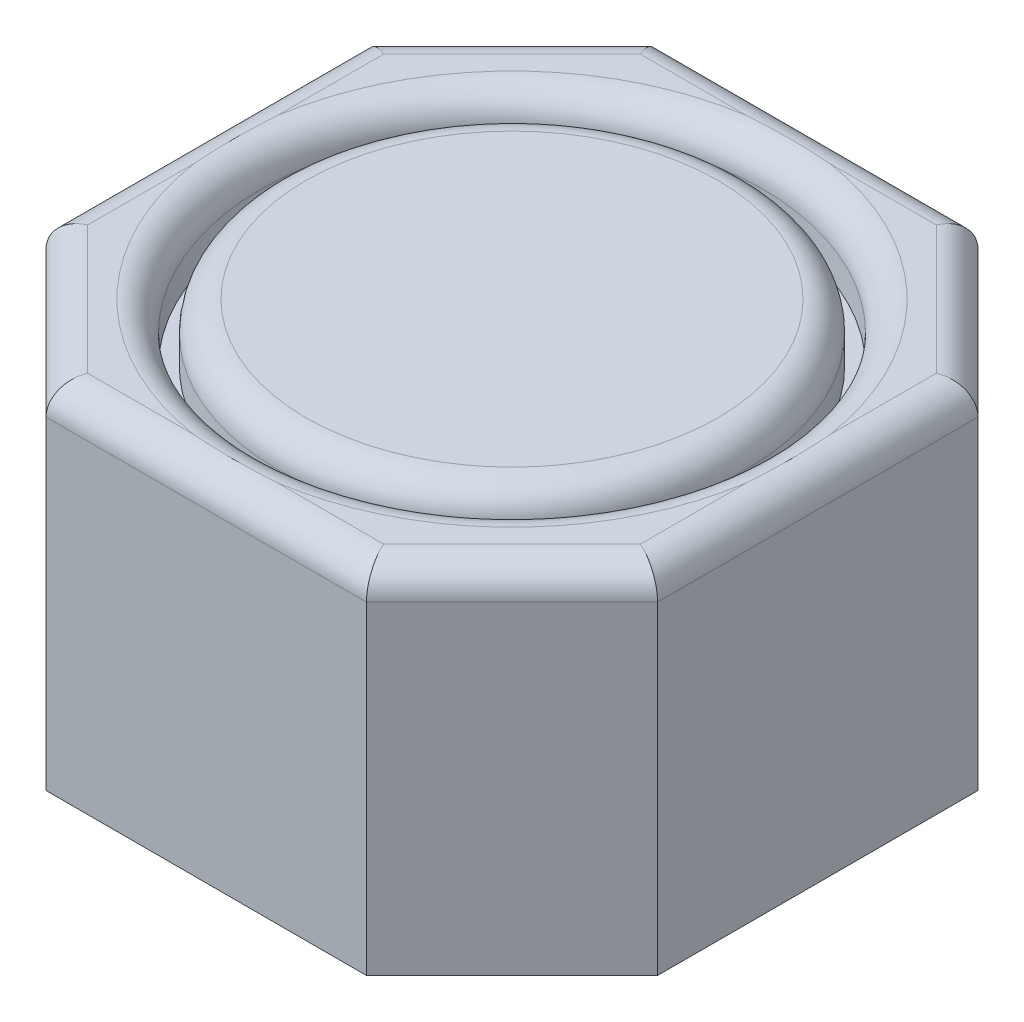
ISO-10303-21;
HEADER;
FILE_DESCRIPTION(('STEP AP214'),'2;1');
FILE_NAME('part.step','',(''),(''),'','','');
FILE_SCHEMA(('AUTOMOTIVE_DESIGN { 1 0 10303 214 1 1 1 1 }'));
ENDSEC;
DATA;
#1=APPLICATION_CONTEXT('core data for automotive mechanical design processes');
#2=APPLICATION_PROTOCOL_DEFINITION('international standard','automotive_design',2000,#1);
#3=PRODUCT_CONTEXT('',#1,'mechanical');
#4=PRODUCT('Part','Part','',(#3));
#5=PRODUCT_RELATED_PRODUCT_CATEGORY('part','',(#4));
#6=PRODUCT_DEFINITION_FORMATION('','',#4);
#7=PRODUCT_DEFINITION_CONTEXT('part definition',#1,'design');
#8=PRODUCT_DEFINITION('design','',#6,#7);
#9=PRODUCT_DEFINITION_SHAPE('','',#8);
#10=(LENGTH_UNIT() NAMED_UNIT(*) SI_UNIT(.MILLI.,.METRE.));
#11=(NAMED_UNIT(*) PLANE_ANGLE_UNIT() SI_UNIT($,.RADIAN.));
#12=(NAMED_UNIT(*) SI_UNIT($,.STERADIAN.) SOLID_ANGLE_UNIT());
#13=UNCERTAINTY_MEASURE_WITH_UNIT(LENGTH_MEASURE(1.E-05),#10,'distance_accuracy_value','');
#14=(GEOMETRIC_REPRESENTATION_CONTEXT(3) GLOBAL_UNCERTAINTY_ASSIGNED_CONTEXT((#13)) GLOBAL_UNIT_ASSIGNED_CONTEXT((#10,
#11,#12)) REPRESENTATION_CONTEXT('',''));
#15=CARTESIAN_POINT('',(0.,0.,0.));
#16=DIRECTION('',(0.,0.,1.));
#17=DIRECTION('',(1.,0.,0.));
#18=AXIS2_PLACEMENT_3D('',#15,#16,#17);
#19=CARTESIAN_POINT('',(0.,3.,0.));
#20=DIRECTION('',(0.,-1.,0.));
#21=DIRECTION('',(0.,0.,-1.));
#22=AXIS2_PLACEMENT_3D('',#19,#20,#21);
#23=PLANE('',#22);
#24=DIRECTION('',(-1.,0.,0.));
#25=VECTOR('',#24,1.);
#26=CARTESIAN_POINT('',(0.,3.,-2.35));
#27=LINE('',#26,#25);
#28=CARTESIAN_POINT('',(-0.349857460318977,3.,-2.35));
#29=VERTEX_POINT('',#28);
#30=CARTESIAN_POINT('',(-1.25900974233027,3.,-2.35));
#31=VERTEX_POINT('',#30);
#32=EDGE_CURVE('E239',#29,#31,#27,.T.);
#33=ORIENTED_EDGE('',*,*,#32,.T.);
#34=DIRECTION('',(-0.707106781186548,0.,0.707106781186548));
#35=VECTOR('',#34,1.);
#36=CARTESIAN_POINT('',(-1.80450487116513,3.,-1.80450487116513));
#37=LINE('',#36,#35);
#38=CARTESIAN_POINT('',(-2.35,3.,-1.25900974233027));
#39=VERTEX_POINT('',#38);
#40=EDGE_CURVE('E241',#31,#39,#37,.T.);
#41=ORIENTED_EDGE('',*,*,#40,.T.);
#42=DIRECTION('',(0.,0.,1.));
#43=VECTOR('',#42,1.);
#44=CARTESIAN_POINT('',(-2.35,3.,0.));
#45=LINE('',#44,#43);
#46=CARTESIAN_POINT('',(-2.35,3.,-0.349857460318965));
#47=VERTEX_POINT('',#46);
#48=EDGE_CURVE('E237',#39,#47,#45,.T.);
#49=ORIENTED_EDGE('',*,*,#48,.T.);
#50=CARTESIAN_POINT('',(0.,3.,0.));
#51=DIRECTION('',(0.,-1.,0.));
#52=DIRECTION('',(0.,0.,-1.));
#53=AXIS2_PLACEMENT_3D('',#50,#51,#52);
#54=CIRCLE('',#53,2.37589988058017);
#55=EDGE_CURVE('E235',#47,#29,#54,.T.);
#56=ORIENTED_EDGE('',*,*,#55,.T.);
#57=EDGE_LOOP('',(#33,#41,#49,#56));
#58=FACE_BOUND('',#57,.T.);
#59=ADVANCED_FACE('F37',(#58),#23,.F.);
#60=DIRECTION('',(-0.707106781186547,0.,-0.707106781186548));
#61=VECTOR('',#60,1.);
#62=CARTESIAN_POINT('',(1.80450487116513,3.,-1.80450487116513));
#63=LINE('',#62,#61);
#64=CARTESIAN_POINT('',(2.35,3.,-1.25900974233027));
#65=VERTEX_POINT('',#64);
#66=CARTESIAN_POINT('',(1.25900974233027,3.,-2.35));
#67=VERTEX_POINT('',#66);
#68=EDGE_CURVE('E230',#65,#67,#63,.T.);
#69=ORIENTED_EDGE('',*,*,#68,.T.);
#70=DIRECTION('',(-1.,0.,0.));
#71=VECTOR('',#70,1.);
#72=CARTESIAN_POINT('',(0.,3.,-2.35));
#73=LINE('',#72,#71);
#74=CARTESIAN_POINT('',(0.349857460318977,3.,-2.35));
#75=VERTEX_POINT('',#74);
#76=EDGE_CURVE('E232',#67,#75,#73,.T.);
#77=ORIENTED_EDGE('',*,*,#76,.T.);
#78=CARTESIAN_POINT('',(0.,3.,0.));
#79=DIRECTION('',(0.,-1.,0.));
#80=DIRECTION('',(0.,0.,-1.));
#81=AXIS2_PLACEMENT_3D('',#78,#79,#80);
#82=CIRCLE('',#81,2.37589988058017);
#83=CARTESIAN_POINT('',(2.35,3.,-0.349857460318983));
#84=VERTEX_POINT('',#83);
#85=EDGE_CURVE('E226',#75,#84,#82,.T.);
#86=ORIENTED_EDGE('',*,*,#85,.T.);
#87=DIRECTION('',(0.,0.,-1.));
#88=VECTOR('',#87,1.);
#89=CARTESIAN_POINT('',(2.35,3.,0.));
#90=LINE('',#89,#88);
#91=EDGE_CURVE('E228',#84,#65,#90,.T.);
#92=ORIENTED_EDGE('',*,*,#91,.T.);
#93=EDGE_LOOP('',(#69,#77,#86,#92));
#94=FACE_BOUND('',#93,.T.);
#95=ADVANCED_FACE('F349',(#94),#23,.F.);
#96=DIRECTION('',(0.707106781186547,0.,-0.707106781186548));
#97=VECTOR('',#96,1.);
#98=CARTESIAN_POINT('',(1.80450487116513,3.,1.80450487116513));
#99=LINE('',#98,#97);
#100=CARTESIAN_POINT('',(1.25900974233027,3.,2.35));
#101=VERTEX_POINT('',#100);
#102=CARTESIAN_POINT('',(2.35,3.,1.25900974233027));
#103=VERTEX_POINT('',#102);
#104=EDGE_CURVE('E221',#101,#103,#99,.T.);
#105=ORIENTED_EDGE('',*,*,#104,.T.);
#106=DIRECTION('',(0.,0.,-1.));
#107=VECTOR('',#106,1.);
#108=CARTESIAN_POINT('',(2.35,3.,0.));
#109=LINE('',#108,#107);
#110=CARTESIAN_POINT('',(2.35,3.,0.349857460318983));
#111=VERTEX_POINT('',#110);
#112=EDGE_CURVE('E223',#103,#111,#109,.T.);
#113=ORIENTED_EDGE('',*,*,#112,.T.);
#114=CARTESIAN_POINT('',(0.,3.,0.));
#115=DIRECTION('',(0.,-1.,0.));
#116=DIRECTION('',(0.,0.,-1.));
#117=AXIS2_PLACEMENT_3D('',#114,#115,#116);
#118=CIRCLE('',#117,2.37589988058017);
#119=CARTESIAN_POINT('',(0.349857460318971,3.,2.35));
#120=VERTEX_POINT('',#119);
#121=EDGE_CURVE('E217',#111,#120,#118,.T.);
#122=ORIENTED_EDGE('',*,*,#121,.T.);
#123=DIRECTION('',(1.,0.,0.));
#124=VECTOR('',#123,1.);
#125=CARTESIAN_POINT('',(0.,3.,2.35));
#126=LINE('',#125,#124);
#127=EDGE_CURVE('E219',#120,#101,#126,.T.);
#128=ORIENTED_EDGE('',*,*,#127,.T.);
#129=EDGE_LOOP('',(#105,#113,#122,#128));
#130=FACE_BOUND('',#129,.T.);
#131=ADVANCED_FACE('F346',(#130),#23,.F.);
#132=CARTESIAN_POINT('',(-2.6,3.,1.36256313292354));
#133=DIRECTION('',(1.,0.,0.));
#134=DIRECTION('',(0.,0.,-1.));
#135=AXIS2_PLACEMENT_3D('',#132,#133,#134);
#136=PLANE('',#135);
#137=DIRECTION('',(0.,-1.,0.));
#138=VECTOR('',#137,1.);
#139=CARTESIAN_POINT('',(-2.6,3.,1.36256313292354));
#140=LINE('',#139,#138);
#141=CARTESIAN_POINT('',(-2.6,2.75,1.36256313292354));
#142=VERTEX_POINT('',#141);
#143=CARTESIAN_POINT('',(-2.6,0.,1.36256313292354));
#144=VERTEX_POINT('',#143);
#145=EDGE_CURVE('E151',#142,#144,#140,.T.);
#146=ORIENTED_EDGE('',*,*,#145,.F.);
#147=DIRECTION('',(0.,0.,1.));
#148=VECTOR('',#147,1.);
#149=CARTESIAN_POINT('',(-2.6,2.75,1.36256313292354));
#150=LINE('',#149,#148);
#151=CARTESIAN_POINT('',(-2.6,2.75,-1.36256313292354));
#152=VERTEX_POINT('',#151);
#153=EDGE_CURVE('E257',#142,#152,#150,.F.);
#154=ORIENTED_EDGE('',*,*,#153,.T.);
#155=DIRECTION('',(0.,-1.,0.));
#156=VECTOR('',#155,1.);
#157=CARTESIAN_POINT('',(-2.6,3.,-1.36256313292354));
#158=LINE('',#157,#156);
#159=CARTESIAN_POINT('',(-2.6,0.,-1.36256313292354));
#160=VERTEX_POINT('',#159);
#161=EDGE_CURVE('E173',#152,#160,#158,.T.);
#162=ORIENTED_EDGE('',*,*,#161,.T.);
#163=DIRECTION('',(0.,0.,1.));
#164=VECTOR('',#163,1.);
#165=CARTESIAN_POINT('',(-2.6,0.,1.36256313292354));
#166=LINE('',#165,#164);
#167=EDGE_CURVE('E166',#160,#144,#166,.T.);
#168=ORIENTED_EDGE('',*,*,#167,.T.);
#169=EDGE_LOOP('',(#146,#154,#162,#168));
#170=FACE_BOUND('',#169,.T.);
#171=ADVANCED_FACE('F171',(#170),#136,.F.);
#172=CARTESIAN_POINT('',(-2.6,3.,1.36256313292354));
#173=DIRECTION('',(0.707106781186547,0.,-0.707106781186547));
#174=DIRECTION('',(-0.707106781186548,0.,-0.707106781186548));
#175=AXIS2_PLACEMENT_3D('',#172,#173,#174);
#176=PLANE('',#175);
#177=DIRECTION('',(0.,-1.,0.));
#178=VECTOR('',#177,1.);
#179=CARTESIAN_POINT('',(-1.36256313292354,3.,2.6));
#180=LINE('',#179,#178);
#181=CARTESIAN_POINT('',(-1.36256313292354,2.75,2.6));
#182=VERTEX_POINT('',#181);
#183=CARTESIAN_POINT('',(-1.36256313292354,0.,2.6));
#184=VERTEX_POINT('',#183);
#185=EDGE_CURVE('E160',#182,#184,#180,.T.);
#186=ORIENTED_EDGE('',*,*,#185,.F.);
#187=DIRECTION('',(0.707106781186548,0.,0.707106781186548));
#188=VECTOR('',#187,1.);
#189=CARTESIAN_POINT('',(-2.6,2.75,1.36256313292354));
#190=LINE('',#189,#188);
#191=EDGE_CURVE('E54',#182,#142,#190,.F.);
#192=ORIENTED_EDGE('',*,*,#191,.T.);
#193=ORIENTED_EDGE('',*,*,#145,.T.);
#194=DIRECTION('',(0.707106781186548,0.,0.707106781186548));
#195=VECTOR('',#194,1.);
#196=CARTESIAN_POINT('',(-2.6,0.,1.36256313292354));
#197=LINE('',#196,#195);
#198=EDGE_CURVE('E154',#144,#184,#197,.T.);
#199=ORIENTED_EDGE('',*,*,#198,.T.);
#200=EDGE_LOOP('',(#186,#192,#193,#199));
#201=FACE_BOUND('',#200,.T.);
#202=ADVANCED_FACE('F153',(#201),#176,.F.);
#203=CARTESIAN_POINT('',(-1.36256313292354,3.,2.6));
#204=DIRECTION('',(0.,0.,-1.));
#205=DIRECTION('',(-1.,0.,0.));
#206=AXIS2_PLACEMENT_3D('',#203,#204,#205);
#207=PLANE('',#206);
#208=DIRECTION('',(0.,-1.,0.));
#209=VECTOR('',#208,1.);
#210=CARTESIAN_POINT('',(1.36256313292354,3.,2.6));
#211=LINE('',#210,#209);
#212=CARTESIAN_POINT('',(1.36256313292354,2.75,2.6));
#213=VERTEX_POINT('',#212);
#214=CARTESIAN_POINT('',(1.36256313292354,0.,2.6));
#215=VERTEX_POINT('',#214);
#216=EDGE_CURVE('E206',#213,#215,#211,.T.);
#217=ORIENTED_EDGE('',*,*,#216,.F.);
#218=DIRECTION('',(1.,0.,0.));
#219=VECTOR('',#218,1.);
#220=CARTESIAN_POINT('',(-1.36256313292354,2.75,2.6));
#221=LINE('',#220,#219);
#222=EDGE_CURVE('E62',#213,#182,#221,.F.);
#223=ORIENTED_EDGE('',*,*,#222,.T.);
#224=ORIENTED_EDGE('',*,*,#185,.T.);
#225=DIRECTION('',(1.,0.,0.));
#226=VECTOR('',#225,1.);
#227=CARTESIAN_POINT('',(-1.36256313292354,0.,2.6));
#228=LINE('',#227,#226);
#229=EDGE_CURVE('E169',#184,#215,#228,.T.);
#230=ORIENTED_EDGE('',*,*,#229,.T.);
#231=EDGE_LOOP('',(#217,#223,#224,#230));
#232=FACE_BOUND('',#231,.T.);
#233=ADVANCED_FACE('F424',(#232),#207,.F.);
#234=CARTESIAN_POINT('',(1.36256313292354,3.,2.6));
#235=DIRECTION('',(-0.707106781186548,0.,-0.707106781186547));
#236=DIRECTION('',(-0.707106781186547,0.,0.707106781186548));
#237=AXIS2_PLACEMENT_3D('',#234,#235,#236);
#238=PLANE('',#237);
#239=DIRECTION('',(0.,-1.,0.));
#240=VECTOR('',#239,1.);
#241=CARTESIAN_POINT('',(2.6,3.,1.36256313292354));
#242=LINE('',#241,#240);
#243=CARTESIAN_POINT('',(2.6,2.75,1.36256313292354));
#244=VERTEX_POINT('',#243);
#245=CARTESIAN_POINT('',(2.6,0.,1.36256313292354));
#246=VERTEX_POINT('',#245);
#247=EDGE_CURVE('E204',#244,#246,#242,.T.);
#248=ORIENTED_EDGE('',*,*,#247,.F.);
#249=DIRECTION('',(0.707106781186547,0.,-0.707106781186548));
#250=VECTOR('',#249,1.);
#251=CARTESIAN_POINT('',(1.36256313292354,2.75,2.6));
#252=LINE('',#251,#250);
#253=EDGE_CURVE('E253',#244,#213,#252,.F.);
#254=ORIENTED_EDGE('',*,*,#253,.T.);
#255=ORIENTED_EDGE('',*,*,#216,.T.);
#256=DIRECTION('',(0.707106781186547,0.,-0.707106781186548));
#257=VECTOR('',#256,1.);
#258=CARTESIAN_POINT('',(1.36256313292354,0.,2.6));
#259=LINE('',#258,#257);
#260=EDGE_CURVE('E183',#215,#246,#259,.T.);
#261=ORIENTED_EDGE('',*,*,#260,.T.);
#262=EDGE_LOOP('',(#248,#254,#255,#261));
#263=FACE_BOUND('',#262,.T.);
#264=ADVANCED_FACE('F423',(#263),#238,.F.);
#265=CARTESIAN_POINT('',(2.6,3.,1.36256313292354));
#266=DIRECTION('',(-1.,0.,0.));
#267=DIRECTION('',(0.,0.,1.));
#268=AXIS2_PLACEMENT_3D('',#265,#266,#267);
#269=PLANE('',#268);
#270=DIRECTION('',(0.,-1.,0.));
#271=VECTOR('',#270,1.);
#272=CARTESIAN_POINT('',(2.6,3.,-1.36256313292354));
#273=LINE('',#272,#271);
#274=CARTESIAN_POINT('',(2.6,2.75,-1.36256313292354));
#275=VERTEX_POINT('',#274);
#276=CARTESIAN_POINT('',(2.6,0.,-1.36256313292354));
#277=VERTEX_POINT('',#276);
#278=EDGE_CURVE('E202',#275,#277,#273,.T.);
#279=ORIENTED_EDGE('',*,*,#278,.F.);
#280=DIRECTION('',(0.,0.,-1.));
#281=VECTOR('',#280,1.);
#282=CARTESIAN_POINT('',(2.6,2.75,1.36256313292354));
#283=LINE('',#282,#281);
#284=EDGE_CURVE('E251',#275,#244,#283,.F.);
#285=ORIENTED_EDGE('',*,*,#284,.T.);
#286=ORIENTED_EDGE('',*,*,#247,.T.);
#287=DIRECTION('',(0.,0.,-1.));
#288=VECTOR('',#287,1.);
#289=CARTESIAN_POINT('',(2.6,0.,1.36256313292354));
#290=LINE('',#289,#288);
#291=EDGE_CURVE('E186',#246,#277,#290,.T.);
#292=ORIENTED_EDGE('',*,*,#291,.T.);
#293=EDGE_LOOP('',(#279,#285,#286,#292));
#294=FACE_BOUND('',#293,.T.);
#295=ADVANCED_FACE('F400',(#294),#269,.F.);
#296=CARTESIAN_POINT('',(1.36256313292354,3.,-2.6));
#297=DIRECTION('',(-0.707106781186548,0.,0.707106781186547));
#298=DIRECTION('',(0.707106781186547,0.,0.707106781186548));
#299=AXIS2_PLACEMENT_3D('',#296,#297,#298);
#300=PLANE('',#299);
#301=DIRECTION('',(0.,-1.,0.));
#302=VECTOR('',#301,1.);
#303=CARTESIAN_POINT('',(1.36256313292354,3.,-2.6));
#304=LINE('',#303,#302);
#305=CARTESIAN_POINT('',(1.36256313292354,2.75,-2.6));
#306=VERTEX_POINT('',#305);
#307=CARTESIAN_POINT('',(1.36256313292354,0.,-2.6));
#308=VERTEX_POINT('',#307);
#309=EDGE_CURVE('E200',#306,#308,#304,.T.);
#310=ORIENTED_EDGE('',*,*,#309,.F.);
#311=DIRECTION('',(-0.707106781186547,0.,-0.707106781186548));
#312=VECTOR('',#311,1.);
#313=CARTESIAN_POINT('',(1.36256313292354,2.75,-2.6));
#314=LINE('',#313,#312);
#315=EDGE_CURVE('E249',#306,#275,#314,.F.);
#316=ORIENTED_EDGE('',*,*,#315,.T.);
#317=ORIENTED_EDGE('',*,*,#278,.T.);
#318=DIRECTION('',(-0.707106781186547,0.,-0.707106781186548));
#319=VECTOR('',#318,1.);
#320=CARTESIAN_POINT('',(1.36256313292354,0.,-2.6));
#321=LINE('',#320,#319);
#322=EDGE_CURVE('E189',#277,#308,#321,.T.);
#323=ORIENTED_EDGE('',*,*,#322,.T.);
#324=EDGE_LOOP('',(#310,#316,#317,#323));
#325=FACE_BOUND('',#324,.T.);
#326=ADVANCED_FACE('F397',(#325),#300,.F.);
#327=CARTESIAN_POINT('',(-1.36256313292354,3.,-2.6));
#328=DIRECTION('',(0.,0.,1.));
#329=DIRECTION('',(1.,0.,0.));
#330=AXIS2_PLACEMENT_3D('',#327,#328,#329);
#331=PLANE('',#330);
#332=DIRECTION('',(0.,-1.,0.));
#333=VECTOR('',#332,1.);
#334=CARTESIAN_POINT('',(-1.36256313292354,3.,-2.6));
#335=LINE('',#334,#333);
#336=CARTESIAN_POINT('',(-1.36256313292354,2.75,-2.6));
#337=VERTEX_POINT('',#336);
#338=CARTESIAN_POINT('',(-1.36256313292354,0.,-2.6));
#339=VERTEX_POINT('',#338);
#340=EDGE_CURVE('E198',#337,#339,#335,.T.);
#341=ORIENTED_EDGE('',*,*,#340,.F.);
#342=DIRECTION('',(-1.,0.,0.));
#343=VECTOR('',#342,1.);
#344=CARTESIAN_POINT('',(-1.36256313292354,2.75,-2.6));
#345=LINE('',#344,#343);
#346=EDGE_CURVE('E247',#337,#306,#345,.F.);
#347=ORIENTED_EDGE('',*,*,#346,.T.);
#348=ORIENTED_EDGE('',*,*,#309,.T.);
#349=DIRECTION('',(-1.,0.,0.));
#350=VECTOR('',#349,1.);
#351=CARTESIAN_POINT('',(-1.36256313292354,0.,-2.6));
#352=LINE('',#351,#350);
#353=EDGE_CURVE('E192',#308,#339,#352,.T.);
#354=ORIENTED_EDGE('',*,*,#353,.T.);
#355=EDGE_LOOP('',(#341,#347,#348,#354));
#356=FACE_BOUND('',#355,.T.);
#357=ADVANCED_FACE('F365',(#356),#331,.F.);
#358=CARTESIAN_POINT('',(-2.6,3.,-1.36256313292354));
#359=DIRECTION('',(0.707106781186547,0.,0.707106781186547));
#360=DIRECTION('',(0.707106781186548,0.,-0.707106781186548));
#361=AXIS2_PLACEMENT_3D('',#358,#359,#360);
#362=PLANE('',#361);
#363=ORIENTED_EDGE('',*,*,#161,.F.);
#364=DIRECTION('',(-0.707106781186548,0.,0.707106781186548));
#365=VECTOR('',#364,1.);
#366=CARTESIAN_POINT('',(-2.6,2.75,-1.36256313292354));
#367=LINE('',#366,#365);
#368=EDGE_CURVE('E244',#152,#337,#367,.F.);
#369=ORIENTED_EDGE('',*,*,#368,.T.);
#370=ORIENTED_EDGE('',*,*,#340,.T.);
#371=DIRECTION('',(-0.707106781186548,0.,0.707106781186548));
#372=VECTOR('',#371,1.);
#373=CARTESIAN_POINT('',(-2.6,0.,-1.36256313292354));
#374=LINE('',#373,#372);
#375=EDGE_CURVE('E195',#339,#160,#374,.T.);
#376=ORIENTED_EDGE('',*,*,#375,.T.);
#377=EDGE_LOOP('',(#363,#369,#370,#376));
#378=FACE_BOUND('',#377,.T.);
#379=ADVANCED_FACE('F358',(#378),#362,.F.);
#380=DIRECTION('',(0.707106781186548,0.,0.707106781186548));
#381=VECTOR('',#380,1.);
#382=CARTESIAN_POINT('',(-1.80450487116513,3.,1.80450487116513));
#383=LINE('',#382,#381);
#384=CARTESIAN_POINT('',(-2.35,3.,1.25900974233027));
#385=VERTEX_POINT('',#384);
#386=CARTESIAN_POINT('',(-1.25900974233027,3.,2.35));
#387=VERTEX_POINT('',#386);
#388=EDGE_CURVE('E212',#385,#387,#383,.T.);
#389=ORIENTED_EDGE('',*,*,#388,.T.);
#390=DIRECTION('',(1.,0.,0.));
#391=VECTOR('',#390,1.);
#392=CARTESIAN_POINT('',(0.,3.,2.35));
#393=LINE('',#392,#391);
#394=CARTESIAN_POINT('',(-0.349857460318971,3.,2.35));
#395=VERTEX_POINT('',#394);
#396=EDGE_CURVE('E214',#387,#395,#393,.T.);
#397=ORIENTED_EDGE('',*,*,#396,.T.);
#398=CARTESIAN_POINT('',(0.,3.,0.));
#399=DIRECTION('',(0.,-1.,0.));
#400=DIRECTION('',(0.,0.,-1.));
#401=AXIS2_PLACEMENT_3D('',#398,#399,#400);
#402=CIRCLE('',#401,2.37589988058017);
#403=CARTESIAN_POINT('',(-2.35,3.,0.349857460318965));
#404=VERTEX_POINT('',#403);
#405=EDGE_CURVE('E159',#395,#404,#402,.T.);
#406=ORIENTED_EDGE('',*,*,#405,.T.);
#407=DIRECTION('',(0.,0.,1.));
#408=VECTOR('',#407,1.);
#409=CARTESIAN_POINT('',(-2.35,3.,0.));
#410=LINE('',#409,#408);
#411=EDGE_CURVE('E210',#404,#385,#410,.T.);
#412=ORIENTED_EDGE('',*,*,#411,.T.);
#413=EDGE_LOOP('',(#389,#397,#406,#412));
#414=FACE_BOUND('',#413,.T.);
#415=ADVANCED_FACE('F345',(#414),#23,.F.);
#416=CARTESIAN_POINT('',(0.,0.,0.));
#417=DIRECTION('',(0.,-1.,0.));
#418=DIRECTION('',(0.,0.,-1.));
#419=AXIS2_PLACEMENT_3D('',#416,#417,#418);
#420=PLANE('',#419);
#421=ORIENTED_EDGE('',*,*,#167,.F.);
#422=ORIENTED_EDGE('',*,*,#375,.F.);
#423=ORIENTED_EDGE('',*,*,#353,.F.);
#424=ORIENTED_EDGE('',*,*,#322,.F.);
#425=ORIENTED_EDGE('',*,*,#291,.F.);
#426=ORIENTED_EDGE('',*,*,#260,.F.);
#427=ORIENTED_EDGE('',*,*,#229,.F.);
#428=ORIENTED_EDGE('',*,*,#198,.F.);
#429=EDGE_LOOP('',(#421,#422,#423,#424,#425,#426,#427,#428));
#430=FACE_BOUND('',#429,.T.);
#431=ADVANCED_FACE('F164',(#430),#420,.T.);
#432=CARTESIAN_POINT('',(0.,2.5,0.));
#433=DIRECTION('',(0.,1.,0.));
#434=DIRECTION('',(0.,0.,1.));
#435=AXIS2_PLACEMENT_3D('',#432,#433,#434);
#436=CYLINDRICAL_SURFACE('',#435,2.);
#437=CARTESIAN_POINT('',(0.,2.75,0.));
#438=DIRECTION('',(0.,-1.,0.));
#439=DIRECTION('',(0.,0.,-1.));
#440=AXIS2_PLACEMENT_3D('',#437,#438,#439);
#441=CIRCLE('',#440,2.);
#442=CARTESIAN_POINT('',(0.,2.75,-2.));
#443=VERTEX_POINT('',#442);
#444=EDGE_CURVE('E11',#443,#443,#441,.T.);
#445=ORIENTED_EDGE('',*,*,#444,.T.);
#446=EDGE_LOOP('',(#445));
#447=FACE_BOUND('',#446,.T.);
#448=CARTESIAN_POINT('',(0.,2.5,0.));
#449=DIRECTION('',(0.,1.,0.));
#450=DIRECTION('',(0.,0.,1.));
#451=AXIS2_PLACEMENT_3D('',#448,#449,#450);
#452=CIRCLE('',#451,2.);
#453=CARTESIAN_POINT('',(0.,2.5,2.));
#454=VERTEX_POINT('',#453);
#455=EDGE_CURVE('E178',#454,#454,#452,.T.);
#456=ORIENTED_EDGE('',*,*,#455,.T.);
#457=EDGE_LOOP('',(#456));
#458=FACE_BOUND('',#457,.T.);
#459=ADVANCED_FACE('F364',(#447,#458),#436,.T.);
#460=CARTESIAN_POINT('',(0.,2.5,0.));
#461=DIRECTION('',(0.,1.,0.));
#462=DIRECTION('',(0.,0.,1.));
#463=AXIS2_PLACEMENT_3D('',#460,#461,#462);
#464=CYLINDRICAL_SURFACE('',#463,2.12589988058017);
#465=CARTESIAN_POINT('',(0.,2.75,0.));
#466=DIRECTION('',(0.,-1.,0.));
#467=DIRECTION('',(0.,0.,-1.));
#468=AXIS2_PLACEMENT_3D('',#465,#466,#467);
#469=CIRCLE('',#468,2.12589988058017);
#470=CARTESIAN_POINT('',(0.,2.75,-2.12589988058017));
#471=VERTEX_POINT('',#470);
#472=EDGE_CURVE('E259',#471,#471,#469,.F.);
#473=ORIENTED_EDGE('',*,*,#472,.T.);
#474=EDGE_LOOP('',(#473));
#475=FACE_BOUND('',#474,.T.);
#476=CARTESIAN_POINT('',(0.,2.5,0.));
#477=DIRECTION('',(0.,1.,0.));
#478=DIRECTION('',(0.,0.,1.));
#479=AXIS2_PLACEMENT_3D('',#476,#477,#478);
#480=CIRCLE('',#479,2.12589988058017);
#481=CARTESIAN_POINT('',(0.,2.5,2.12589988058017));
#482=VERTEX_POINT('',#481);
#483=EDGE_CURVE('E175',#482,#482,#480,.T.);
#484=ORIENTED_EDGE('',*,*,#483,.F.);
#485=EDGE_LOOP('',(#484));
#486=FACE_BOUND('',#485,.T.);
#487=ADVANCED_FACE('F449',(#475,#486),#464,.F.);
#488=CARTESIAN_POINT('',(0.,2.5,0.));
#489=DIRECTION('',(0.,1.,0.));
#490=DIRECTION('',(0.,0.,1.));
#491=AXIS2_PLACEMENT_3D('',#488,#489,#490);
#492=PLANE('',#491);
#493=ORIENTED_EDGE('',*,*,#455,.F.);
#494=EDGE_LOOP('',(#493));
#495=FACE_BOUND('',#494,.T.);
#496=ORIENTED_EDGE('',*,*,#483,.T.);
#497=EDGE_LOOP('',(#496));
#498=FACE_BOUND('',#497,.T.);
#499=ADVANCED_FACE('F342',(#495,#498),#492,.T.);
#500=CARTESIAN_POINT('',(0.,3.,0.));
#501=DIRECTION('',(0.,-1.,0.));
#502=DIRECTION('',(0.,0.,-1.));
#503=AXIS2_PLACEMENT_3D('',#500,#501,#502);
#504=CIRCLE('',#503,1.75);
#505=CARTESIAN_POINT('',(0.,3.,-1.75));
#506=VERTEX_POINT('',#505);
#507=EDGE_CURVE('E46',#506,#506,#504,.F.);
#508=ORIENTED_EDGE('',*,*,#507,.T.);
#509=EDGE_LOOP('',(#508));
#510=FACE_BOUND('',#509,.T.);
#511=ADVANCED_FACE('F337',(#510),#23,.F.);
#512=CARTESIAN_POINT('',(1.80450487116513,2.75,1.80450487116513));
#513=DIRECTION('',(0.707106781186547,0.,-0.707106781186548));
#514=DIRECTION('',(-0.707106781186548,0.,-0.707106781186547));
#515=AXIS2_PLACEMENT_3D('',#512,#513,#514);
#516=CYLINDRICAL_SURFACE('',#515,0.25);
#517=CARTESIAN_POINT('',(1.25900974233027,2.75,2.35));
#518=DIRECTION('',(0.923879532511287,0.,-0.38268343236509));
#519=DIRECTION('',(0.38268343236509,0.,0.923879532511287));
#520=AXIS2_PLACEMENT_3D('',#517,#518,#519);
#521=ELLIPSE('',#520,0.270598050073099,0.25);
#522=EDGE_CURVE('E409',#213,#101,#521,.F.);
#523=ORIENTED_EDGE('',*,*,#522,.F.);
#524=ORIENTED_EDGE('',*,*,#253,.F.);
#525=CARTESIAN_POINT('',(2.35,2.75,1.25900974233027));
#526=DIRECTION('',(0.38268343236509,0.,-0.923879532511287));
#527=DIRECTION('',(0.923879532511287,0.,0.38268343236509));
#528=AXIS2_PLACEMENT_3D('',#525,#526,#527);
#529=ELLIPSE('',#528,0.270598050073099,0.25);
#530=EDGE_CURVE('E41',#103,#244,#529,.T.);
#531=ORIENTED_EDGE('',*,*,#530,.F.);
#532=ORIENTED_EDGE('',*,*,#104,.F.);
#533=EDGE_LOOP('',(#523,#524,#531,#532));
#534=FACE_BOUND('',#533,.T.);
#535=ADVANCED_FACE('F331',(#534),#516,.T.);
#536=CARTESIAN_POINT('',(2.35,2.75,0.));
#537=DIRECTION('',(0.,0.,-1.));
#538=DIRECTION('',(-1.,0.,0.));
#539=AXIS2_PLACEMENT_3D('',#536,#537,#538);
#540=CYLINDRICAL_SURFACE('',#539,0.25);
#541=ORIENTED_EDGE('',*,*,#530,.T.);
#542=ORIENTED_EDGE('',*,*,#284,.F.);
#543=CARTESIAN_POINT('',(2.35,2.75,-1.25900974233027));
#544=DIRECTION('',(-0.38268343236509,0.,-0.923879532511287));
#545=DIRECTION('',(0.923879532511287,0.,-0.38268343236509));
#546=AXIS2_PLACEMENT_3D('',#543,#544,#545);
#547=ELLIPSE('',#546,0.270598050073099,0.25);
#548=EDGE_CURVE('E325',#65,#275,#547,.T.);
#549=ORIENTED_EDGE('',*,*,#548,.F.);
#550=ORIENTED_EDGE('',*,*,#91,.F.);
#551=CARTESIAN_POINT('',(2.35,3.00000000000001,0.349857460318981));
#552=CARTESIAN_POINT('',(2.35020280118476,2.99999996778751,0.347118045146289));
#553=CARTESIAN_POINT('',(2.35040323180037,2.99999972309066,0.344378436709852));
#554=CARTESIAN_POINT('',(2.35661996064454,2.99998571786577,0.258381054958786));
#555=CARTESIAN_POINT('',(2.36044877854258,2.99978608784383,0.174949431486071));
#556=CARTESIAN_POINT('',(2.36368056561342,2.9996313486657,0.00799781763714711));
#557=CARTESIAN_POINT('',(2.3630830302689,2.9996762673831,-0.0755221817273699));
#558=CARTESIAN_POINT('',(2.35822633796701,2.99987082819775,-0.219914021400877));
#559=CARTESIAN_POINT('',(2.35499781200885,2.99998897113619,-0.280821075719154));
#560=CARTESIAN_POINT('',(2.35040323073713,2.9999997411647,-0.34437842975933));
#561=CARTESIAN_POINT('',(2.35020280007557,2.99999998658301,-0.347118038096838));
#562=CARTESIAN_POINT('',(2.35,3.00000000000001,-0.349857460318981));
#563=B_SPLINE_CURVE_WITH_KNOTS('',3,(#551,#552,#553,#554,#555,#556,#557,#558,#559,#560,#561,
#562),.UNSPECIFIED.,.F.,.F.,(4,2,2,2,2,4),(0.,0.00824078649335676,0.258663721084887,
0.509115199410257,0.692043295851107,0.700284082344464),.UNSPECIFIED.);
#564=EDGE_CURVE('E317',#111,#84,#563,.T.);
#565=ORIENTED_EDGE('',*,*,#564,.F.);
#566=ORIENTED_EDGE('',*,*,#112,.F.);
#567=EDGE_LOOP('',(#541,#542,#549,#550,#565,#566));
#568=FACE_BOUND('',#567,.T.);
#569=ADVANCED_FACE('F327',(#568),#540,.T.);
#570=CARTESIAN_POINT('',(0.,2.75,2.35));
#571=DIRECTION('',(1.,0.,0.));
#572=DIRECTION('',(0.,0.,-1.));
#573=AXIS2_PLACEMENT_3D('',#570,#571,#572);
#574=CYLINDRICAL_SURFACE('',#573,0.25);
#575=ORIENTED_EDGE('',*,*,#522,.T.);
#576=ORIENTED_EDGE('',*,*,#127,.F.);
#577=CARTESIAN_POINT('',(-0.349857460318973,3.00000000000001,2.35));
#578=CARTESIAN_POINT('',(-0.347118045146281,2.99999996778751,2.35020280118476));
#579=CARTESIAN_POINT('',(-0.344378436709843,2.99999972309066,2.35040323180037));
#580=CARTESIAN_POINT('',(-0.258381054958775,2.99998571786577,2.35661996064453));
#581=CARTESIAN_POINT('',(-0.174949431486059,2.99978608784384,2.36044877854258));
#582=CARTESIAN_POINT('',(-0.00799781763713429,2.9996313486657,2.36368056561343));
#583=CARTESIAN_POINT('',(0.0755221817273836,2.9996762673831,2.36308303026891));
#584=CARTESIAN_POINT('',(0.219914021400882,2.99987082819775,2.358226337967));
#585=CARTESIAN_POINT('',(0.28082107571915,2.99998897113619,2.35499781200882));
#586=CARTESIAN_POINT('',(0.344378429759319,2.9999997411647,2.35040323073713));
#587=CARTESIAN_POINT('',(0.347118038096827,2.99999998658301,2.35020280007557));
#588=CARTESIAN_POINT('',(0.349857460318969,3.00000000000001,2.35));
#589=B_SPLINE_CURVE_WITH_KNOTS('',3,(#577,#578,#579,#580,#581,#582,#583,#584,#585,#586,#587,
#588),.UNSPECIFIED.,.F.,.F.,(4,2,2,2,2,4),(0.,0.00824078649335722,0.258663721084891,
0.509115199410262,0.692043295851087,0.700284082344444),.UNSPECIFIED.);
#590=EDGE_CURVE('E310',#395,#120,#589,.T.);
#591=ORIENTED_EDGE('',*,*,#590,.F.);
#592=ORIENTED_EDGE('',*,*,#396,.F.);
#593=CARTESIAN_POINT('',(-1.25900974233027,2.75,2.35));
#594=DIRECTION('',(0.923879532511287,0.,0.38268343236509));
#595=DIRECTION('',(-0.38268343236509,0.,0.923879532511287));
#596=AXIS2_PLACEMENT_3D('',#593,#594,#595);
#597=ELLIPSE('',#596,0.270598050073099,0.25);
#598=EDGE_CURVE('E318',#182,#387,#597,.F.);
#599=ORIENTED_EDGE('',*,*,#598,.F.);
#600=ORIENTED_EDGE('',*,*,#222,.F.);
#601=EDGE_LOOP('',(#575,#576,#591,#592,#599,#600));
#602=FACE_BOUND('',#601,.T.);
#603=ADVANCED_FACE('F306',(#602),#574,.T.);
#604=CARTESIAN_POINT('',(1.80450487116513,2.75,-1.80450487116513));
#605=DIRECTION('',(-0.707106781186547,0.,-0.707106781186548));
#606=DIRECTION('',(-0.707106781186548,0.,0.707106781186547));
#607=AXIS2_PLACEMENT_3D('',#604,#605,#606);
#608=CYLINDRICAL_SURFACE('',#607,0.25);
#609=ORIENTED_EDGE('',*,*,#548,.T.);
#610=ORIENTED_EDGE('',*,*,#315,.F.);
#611=CARTESIAN_POINT('',(1.25900974233027,2.75,-2.35));
#612=DIRECTION('',(-0.923879532511287,0.,-0.38268343236509));
#613=DIRECTION('',(0.38268343236509,0.,-0.923879532511287));
#614=AXIS2_PLACEMENT_3D('',#611,#612,#613);
#615=ELLIPSE('',#614,0.270598050073099,0.25);
#616=EDGE_CURVE('E377',#67,#306,#615,.T.);
#617=ORIENTED_EDGE('',*,*,#616,.F.);
#618=ORIENTED_EDGE('',*,*,#68,.F.);
#619=EDGE_LOOP('',(#609,#610,#617,#618));
#620=FACE_BOUND('',#619,.T.);
#621=ADVANCED_FACE('F333',(#620),#608,.T.);
#622=CARTESIAN_POINT('',(0.,2.75,0.));
#623=DIRECTION('',(0.,-1.,0.));
#624=DIRECTION('',(0.,0.,-1.));
#625=AXIS2_PLACEMENT_3D('',#622,#623,#624);
#626=TOROIDAL_SURFACE('',#625,2.37589988058017,0.25);
#627=ORIENTED_EDGE('',*,*,#472,.F.);
#628=EDGE_LOOP('',(#627));
#629=FACE_BOUND('',#628,.T.);
#630=ORIENTED_EDGE('',*,*,#564,.T.);
#631=ORIENTED_EDGE('',*,*,#85,.F.);
#632=CARTESIAN_POINT('',(-0.349857460318977,3.00000000000001,-2.35));
#633=CARTESIAN_POINT('',(-0.347118045146285,2.99999996778751,-2.35020280118476));
#634=CARTESIAN_POINT('',(-0.344378436709847,2.99999972309066,-2.35040323180037));
#635=CARTESIAN_POINT('',(-0.258381054958778,2.99998571786584,-2.35661996064452));
#636=CARTESIAN_POINT('',(-0.174949431486062,2.99978608784386,-2.36044877854258));
#637=CARTESIAN_POINT('',(-0.00799781763713646,2.99963134866567,-2.36368056561343));
#638=CARTESIAN_POINT('',(0.075522181727382,2.99967626738307,-2.36308303026891));
#639=CARTESIAN_POINT('',(0.219914021400884,2.99987082819777,-2.358226337967));
#640=CARTESIAN_POINT('',(0.280821075719156,2.99998897113625,-2.35499781200882));
#641=CARTESIAN_POINT('',(0.344378429759328,2.9999997411647,-2.35040323073713));
#642=CARTESIAN_POINT('',(0.347118038096836,2.99999998658301,-2.35020280007557));
#643=CARTESIAN_POINT('',(0.349857460318979,3.00000000000001,-2.35));
#644=B_SPLINE_CURVE_WITH_KNOTS('',3,(#632,#633,#634,#635,#636,#637,#638,#639,#640,#641,#642,
#643),.UNSPECIFIED.,.F.,.F.,(4,2,2,2,2,4),(0.,0.00824078649335721,0.258663721084892,
0.509115199410265,0.692043295851101,0.700284082344457),.UNSPECIFIED.);
#645=EDGE_CURVE('E279',#29,#75,#644,.T.);
#646=ORIENTED_EDGE('',*,*,#645,.F.);
#647=ORIENTED_EDGE('',*,*,#55,.F.);
#648=CARTESIAN_POINT('',(-2.35,3.00000000000001,-0.349857460318965));
#649=CARTESIAN_POINT('',(-2.35020280118476,2.99999996778751,-0.347118045146273));
#650=CARTESIAN_POINT('',(-2.35040323180037,2.99999972309066,-0.344378436709835));
#651=CARTESIAN_POINT('',(-2.35661996064452,2.99998571786584,-0.258381054958767));
#652=CARTESIAN_POINT('',(-2.36044877854258,2.99978608784386,-0.174949431486051));
#653=CARTESIAN_POINT('',(-2.36368056561343,2.99963134866567,-0.00799781763712563));
#654=CARTESIAN_POINT('',(-2.36308303026891,2.99967626738307,0.0755221817273925));
#655=CARTESIAN_POINT('',(-2.35822633796701,2.99987082819777,0.219914021400887));
#656=CARTESIAN_POINT('',(-2.35499781200884,2.99998897113625,0.280821075719151));
#657=CARTESIAN_POINT('',(-2.35040323073713,2.9999997411647,0.344378429759314));
#658=CARTESIAN_POINT('',(-2.35020280007557,2.99999998658301,0.347118038096822));
#659=CARTESIAN_POINT('',(-2.35,3.00000000000001,0.349857460318965));
#660=B_SPLINE_CURVE_WITH_KNOTS('',3,(#648,#649,#650,#651,#652,#653,#654,#655,#656,#657,#658,
#659),.UNSPECIFIED.,.F.,.F.,(4,2,2,2,2,4),(0.,0.00824078649335742,0.258663721084892,
0.509115199410264,0.692043295851075,0.700284082344432),.UNSPECIFIED.);
#661=EDGE_CURVE('E271',#404,#47,#660,.F.);
#662=ORIENTED_EDGE('',*,*,#661,.F.);
#663=ORIENTED_EDGE('',*,*,#405,.F.);
#664=ORIENTED_EDGE('',*,*,#590,.T.);
#665=ORIENTED_EDGE('',*,*,#121,.F.);
#666=EDGE_LOOP('',(#630,#631,#646,#647,#662,#663,#664,#665));
#667=FACE_BOUND('',#666,.T.);
#668=ADVANCED_FACE('F285',(#629,#667),#626,.T.);
#669=CARTESIAN_POINT('',(-1.80450487116513,2.75,1.80450487116513));
#670=DIRECTION('',(0.707106781186548,0.,0.707106781186548));
#671=DIRECTION('',(0.707106781186548,0.,-0.707106781186548));
#672=AXIS2_PLACEMENT_3D('',#669,#670,#671);
#673=CYLINDRICAL_SURFACE('',#672,0.25);
#674=ORIENTED_EDGE('',*,*,#598,.T.);
#675=ORIENTED_EDGE('',*,*,#388,.F.);
#676=CARTESIAN_POINT('',(-2.35,2.75,1.25900974233027));
#677=DIRECTION('',(0.38268343236509,0.,0.923879532511287));
#678=DIRECTION('',(-0.923879532511287,0.,0.38268343236509));
#679=AXIS2_PLACEMENT_3D('',#676,#677,#678);
#680=ELLIPSE('',#679,0.270598050073099,0.25);
#681=EDGE_CURVE('E268',#142,#385,#680,.F.);
#682=ORIENTED_EDGE('',*,*,#681,.F.);
#683=ORIENTED_EDGE('',*,*,#191,.F.);
#684=EDGE_LOOP('',(#674,#675,#682,#683));
#685=FACE_BOUND('',#684,.T.);
#686=ADVANCED_FACE('F299',(#685),#673,.T.);
#687=CARTESIAN_POINT('',(0.,2.75,-2.35));
#688=DIRECTION('',(-1.,0.,0.));
#689=DIRECTION('',(0.,0.,1.));
#690=AXIS2_PLACEMENT_3D('',#687,#688,#689);
#691=CYLINDRICAL_SURFACE('',#690,0.25);
#692=ORIENTED_EDGE('',*,*,#616,.T.);
#693=ORIENTED_EDGE('',*,*,#346,.F.);
#694=CARTESIAN_POINT('',(-1.25900974233027,2.75,-2.35));
#695=DIRECTION('',(-0.923879532511287,0.,0.38268343236509));
#696=DIRECTION('',(-0.38268343236509,0.,-0.923879532511287));
#697=AXIS2_PLACEMENT_3D('',#694,#695,#696);
#698=ELLIPSE('',#697,0.270598050073099,0.25);
#699=EDGE_CURVE('E266',#31,#337,#698,.T.);
#700=ORIENTED_EDGE('',*,*,#699,.F.);
#701=ORIENTED_EDGE('',*,*,#32,.F.);
#702=ORIENTED_EDGE('',*,*,#645,.T.);
#703=ORIENTED_EDGE('',*,*,#76,.F.);
#704=EDGE_LOOP('',(#692,#693,#700,#701,#702,#703));
#705=FACE_BOUND('',#704,.T.);
#706=ADVANCED_FACE('F293',(#705),#691,.T.);
#707=CARTESIAN_POINT('',(-2.35,2.75,0.));
#708=DIRECTION('',(0.,0.,1.));
#709=DIRECTION('',(1.,0.,0.));
#710=AXIS2_PLACEMENT_3D('',#707,#708,#709);
#711=CYLINDRICAL_SURFACE('',#710,0.25);
#712=ORIENTED_EDGE('',*,*,#661,.T.);
#713=ORIENTED_EDGE('',*,*,#48,.F.);
#714=CARTESIAN_POINT('',(-2.35,2.75,-1.25900974233027));
#715=DIRECTION('',(-0.38268343236509,0.,0.923879532511287));
#716=DIRECTION('',(0.923879532511287,0.,0.38268343236509));
#717=AXIS2_PLACEMENT_3D('',#714,#715,#716);
#718=ELLIPSE('',#717,0.270598050073099,0.25);
#719=EDGE_CURVE('E264',#152,#39,#718,.F.);
#720=ORIENTED_EDGE('',*,*,#719,.F.);
#721=ORIENTED_EDGE('',*,*,#153,.F.);
#722=ORIENTED_EDGE('',*,*,#681,.T.);
#723=ORIENTED_EDGE('',*,*,#411,.F.);
#724=EDGE_LOOP('',(#712,#713,#720,#721,#722,#723));
#725=FACE_BOUND('',#724,.T.);
#726=ADVANCED_FACE('F290',(#725),#711,.T.);
#727=CARTESIAN_POINT('',(-1.80450487116513,2.75,-1.80450487116513));
#728=DIRECTION('',(-0.707106781186548,0.,0.707106781186548));
#729=DIRECTION('',(0.707106781186548,0.,0.707106781186548));
#730=AXIS2_PLACEMENT_3D('',#727,#728,#729);
#731=CYLINDRICAL_SURFACE('',#730,0.25);
#732=ORIENTED_EDGE('',*,*,#699,.T.);
#733=ORIENTED_EDGE('',*,*,#368,.F.);
#734=ORIENTED_EDGE('',*,*,#719,.T.);
#735=ORIENTED_EDGE('',*,*,#40,.F.);
#736=EDGE_LOOP('',(#732,#733,#734,#735));
#737=FACE_BOUND('',#736,.T.);
#738=ADVANCED_FACE('F292',(#737),#731,.T.);
#739=CARTESIAN_POINT('',(0.,2.75,0.));
#740=DIRECTION('',(0.,-1.,0.));
#741=DIRECTION('',(0.,0.,-1.));
#742=AXIS2_PLACEMENT_3D('',#739,#740,#741);
#743=TOROIDAL_SURFACE('',#742,1.75,0.25);
#744=ORIENTED_EDGE('',*,*,#444,.F.);
#745=EDGE_LOOP('',(#744));
#746=FACE_BOUND('',#745,.T.);
#747=ORIENTED_EDGE('',*,*,#507,.F.);
#748=EDGE_LOOP('',(#747));
#749=FACE_BOUND('',#748,.T.);
#750=ADVANCED_FACE('F39',(#746,#749),#743,.T.);
#751=CLOSED_SHELL('',(#59,#95,#131,#171,#202,#233,#264,#295,#326,#357,#379,#415,#431,#459,#487,
#499,#511,#535,#569,#603,#621,#668,#686,#706,#726,#738,#750));
#752=MANIFOLD_SOLID_BREP('B2',#751);
#753=ADVANCED_BREP_SHAPE_REPRESENTATION('',(#18,#752),#14);
#754=SHAPE_DEFINITION_REPRESENTATION(#9,#753);
ENDSEC;
END-ISO-10303-21;
